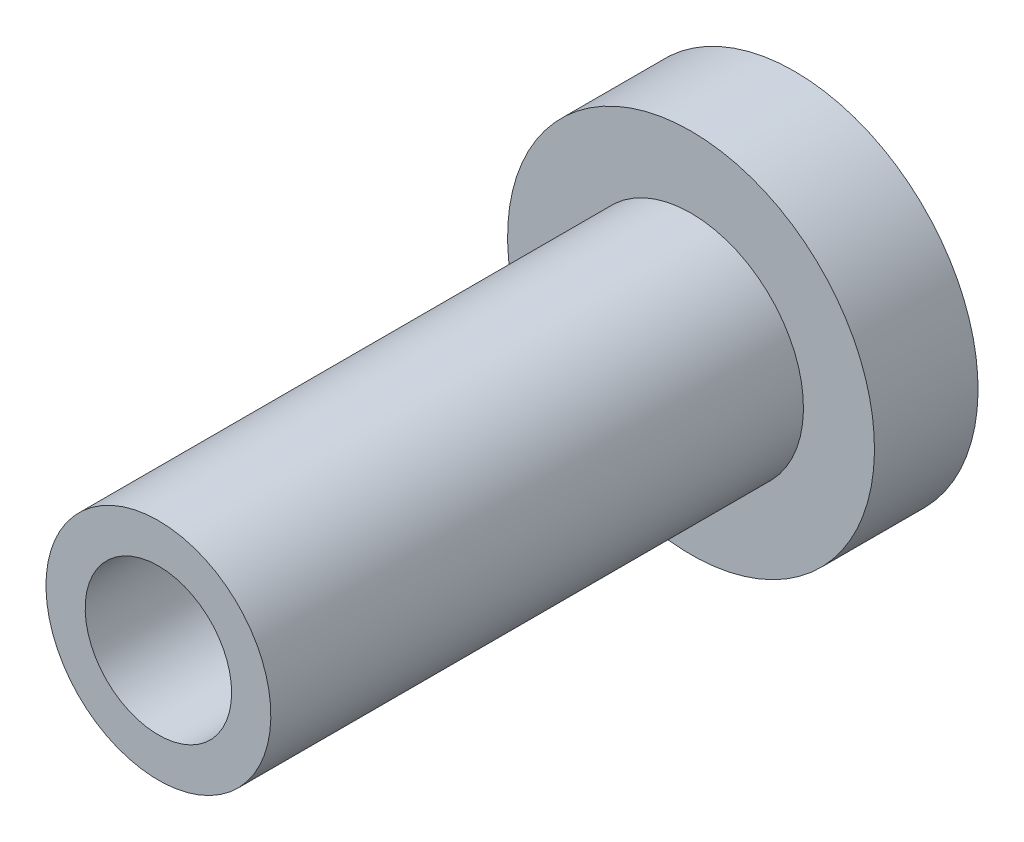
ISO-10303-21;
HEADER;
FILE_DESCRIPTION(('STEP AP214'),'2;1');
FILE_NAME('part.step','',(''),(''),'','','');
FILE_SCHEMA(('AUTOMOTIVE_DESIGN { 1 0 10303 214 1 1 1 1 }'));
ENDSEC;
DATA;
#1=APPLICATION_CONTEXT('core data for automotive mechanical design processes');
#2=APPLICATION_PROTOCOL_DEFINITION('international standard','automotive_design',2000,#1);
#3=PRODUCT_CONTEXT('',#1,'mechanical');
#4=PRODUCT('Part','Part','',(#3));
#5=PRODUCT_RELATED_PRODUCT_CATEGORY('part','',(#4));
#6=PRODUCT_DEFINITION_FORMATION('','',#4);
#7=PRODUCT_DEFINITION_CONTEXT('part definition',#1,'design');
#8=PRODUCT_DEFINITION('design','',#6,#7);
#9=PRODUCT_DEFINITION_SHAPE('','',#8);
#10=(LENGTH_UNIT() NAMED_UNIT(*) SI_UNIT(.MILLI.,.METRE.));
#11=(NAMED_UNIT(*) PLANE_ANGLE_UNIT() SI_UNIT($,.RADIAN.));
#12=(NAMED_UNIT(*) SI_UNIT($,.STERADIAN.) SOLID_ANGLE_UNIT());
#13=UNCERTAINTY_MEASURE_WITH_UNIT(LENGTH_MEASURE(1.E-05),#10,'distance_accuracy_value','');
#14=(GEOMETRIC_REPRESENTATION_CONTEXT(3) GLOBAL_UNCERTAINTY_ASSIGNED_CONTEXT((#13)) GLOBAL_UNIT_ASSIGNED_CONTEXT((#10,
#11,#12)) REPRESENTATION_CONTEXT('',''));
#15=CARTESIAN_POINT('',(0.,0.,0.));
#16=DIRECTION('',(0.,0.,1.));
#17=DIRECTION('',(1.,0.,0.));
#18=AXIS2_PLACEMENT_3D('',#15,#16,#17);
#19=CARTESIAN_POINT('',(0.,-6.2,0.));
#20=DIRECTION('',(0.,0.,1.));
#21=DIRECTION('',(0.,-1.,0.));
#22=AXIS2_PLACEMENT_3D('',#19,#20,#21);
#23=PLANE('',#22);
#24=CARTESIAN_POINT('',(0.,0.,0.));
#25=DIRECTION('',(0.,0.,1.));
#26=DIRECTION('',(1.,0.,0.));
#27=AXIS2_PLACEMENT_3D('',#24,#25,#26);
#28=CIRCLE('',#27,2.475);
#29=CARTESIAN_POINT('',(2.475,0.,0.));
#30=VERTEX_POINT('',#29);
#31=EDGE_CURVE('E56',#30,#30,#28,.T.);
#32=ORIENTED_EDGE('',*,*,#31,.T.);
#33=EDGE_LOOP('',(#32));
#34=FACE_BOUND('',#33,.T.);
#35=CARTESIAN_POINT('',(0.,0.,0.));
#36=DIRECTION('',(0.,0.,-1.));
#37=DIRECTION('',(0.,1.,0.));
#38=AXIS2_PLACEMENT_3D('',#35,#36,#37);
#39=CIRCLE('',#38,6.2);
#40=CARTESIAN_POINT('',(0.,6.2,0.));
#41=VERTEX_POINT('',#40);
#42=EDGE_CURVE('E53',#41,#41,#39,.T.);
#43=ORIENTED_EDGE('',*,*,#42,.T.);
#44=EDGE_LOOP('',(#43));
#45=FACE_BOUND('',#44,.T.);
#46=ADVANCED_FACE('F37',(#34,#45),#23,.F.);
#47=CARTESIAN_POINT('',(0.,0.,21.5));
#48=DIRECTION('',(0.,0.,-1.));
#49=DIRECTION('',(0.,1.,0.));
#50=AXIS2_PLACEMENT_3D('',#47,#48,#49);
#51=PLANE('',#50);
#52=CARTESIAN_POINT('',(0.,0.,21.5));
#53=DIRECTION('',(0.,0.,-1.));
#54=DIRECTION('',(0.,1.,0.));
#55=AXIS2_PLACEMENT_3D('',#52,#53,#54);
#56=CIRCLE('',#55,2.475);
#57=CARTESIAN_POINT('',(0.,2.475,21.5));
#58=VERTEX_POINT('',#57);
#59=EDGE_CURVE('E40',#58,#58,#56,.T.);
#60=ORIENTED_EDGE('',*,*,#59,.T.);
#61=EDGE_LOOP('',(#60));
#62=FACE_BOUND('',#61,.T.);
#63=CARTESIAN_POINT('',(0.,0.,21.5));
#64=DIRECTION('',(0.,0.,-1.));
#65=DIRECTION('',(0.,1.,0.));
#66=AXIS2_PLACEMENT_3D('',#63,#64,#65);
#67=CIRCLE('',#66,3.8);
#68=CARTESIAN_POINT('',(0.,3.8,21.5));
#69=VERTEX_POINT('',#68);
#70=EDGE_CURVE('E10',#69,#69,#67,.T.);
#71=ORIENTED_EDGE('',*,*,#70,.F.);
#72=EDGE_LOOP('',(#71));
#73=FACE_BOUND('',#72,.T.);
#74=ADVANCED_FACE('F63',(#62,#73),#51,.F.);
#75=CARTESIAN_POINT('',(0.,0.,0.));
#76=DIRECTION('',(0.,0.,-1.));
#77=DIRECTION('',(0.,1.,0.));
#78=AXIS2_PLACEMENT_3D('',#75,#76,#77);
#79=CYLINDRICAL_SURFACE('',#78,3.8);
#80=CARTESIAN_POINT('',(0.,0.,3.5));
#81=DIRECTION('',(0.,0.,-1.));
#82=DIRECTION('',(0.,1.,0.));
#83=AXIS2_PLACEMENT_3D('',#80,#81,#82);
#84=CIRCLE('',#83,3.8);
#85=CARTESIAN_POINT('',(0.,3.8,3.5));
#86=VERTEX_POINT('',#85);
#87=EDGE_CURVE('E44',#86,#86,#84,.T.);
#88=ORIENTED_EDGE('',*,*,#87,.F.);
#89=EDGE_LOOP('',(#88));
#90=FACE_BOUND('',#89,.T.);
#91=ORIENTED_EDGE('',*,*,#70,.T.);
#92=EDGE_LOOP('',(#91));
#93=FACE_BOUND('',#92,.T.);
#94=ADVANCED_FACE('F81',(#90,#93),#79,.T.);
#95=CARTESIAN_POINT('',(0.,-3.8,3.5));
#96=DIRECTION('',(0.,0.,-1.));
#97=DIRECTION('',(0.,1.,0.));
#98=AXIS2_PLACEMENT_3D('',#95,#96,#97);
#99=PLANE('',#98);
#100=CARTESIAN_POINT('',(0.,0.,3.5));
#101=DIRECTION('',(0.,0.,-1.));
#102=DIRECTION('',(0.,1.,0.));
#103=AXIS2_PLACEMENT_3D('',#100,#101,#102);
#104=CIRCLE('',#103,6.2);
#105=CARTESIAN_POINT('',(0.,6.2,3.5));
#106=VERTEX_POINT('',#105);
#107=EDGE_CURVE('E48',#106,#106,#104,.T.);
#108=ORIENTED_EDGE('',*,*,#107,.F.);
#109=EDGE_LOOP('',(#108));
#110=FACE_BOUND('',#109,.T.);
#111=ORIENTED_EDGE('',*,*,#87,.T.);
#112=EDGE_LOOP('',(#111));
#113=FACE_BOUND('',#112,.T.);
#114=ADVANCED_FACE('F75',(#110,#113),#99,.F.);
#115=CARTESIAN_POINT('',(0.,0.,0.));
#116=DIRECTION('',(0.,0.,-1.));
#117=DIRECTION('',(0.,1.,0.));
#118=AXIS2_PLACEMENT_3D('',#115,#116,#117);
#119=CYLINDRICAL_SURFACE('',#118,6.2);
#120=ORIENTED_EDGE('',*,*,#42,.F.);
#121=EDGE_LOOP('',(#120));
#122=FACE_BOUND('',#121,.T.);
#123=ORIENTED_EDGE('',*,*,#107,.T.);
#124=EDGE_LOOP('',(#123));
#125=FACE_BOUND('',#124,.T.);
#126=ADVANCED_FACE('F68',(#122,#125),#119,.T.);
#127=CARTESIAN_POINT('',(0.,0.,0.));
#128=DIRECTION('',(0.,0.,1.));
#129=DIRECTION('',(1.,0.,0.));
#130=AXIS2_PLACEMENT_3D('',#127,#128,#129);
#131=CYLINDRICAL_SURFACE('',#130,2.475);
#132=ORIENTED_EDGE('',*,*,#31,.F.);
#133=EDGE_LOOP('',(#132));
#134=FACE_BOUND('',#133,.T.);
#135=ORIENTED_EDGE('',*,*,#59,.F.);
#136=EDGE_LOOP('',(#135));
#137=FACE_BOUND('',#136,.T.);
#138=ADVANCED_FACE('F66',(#134,#137),#131,.F.);
#139=CLOSED_SHELL('',(#46,#74,#94,#114,#126,#138));
#140=MANIFOLD_SOLID_BREP('B2',#139);
#141=ADVANCED_BREP_SHAPE_REPRESENTATION('',(#18,#140),#14);
#142=SHAPE_DEFINITION_REPRESENTATION(#9,#141);
ENDSEC;
END-ISO-10303-21;
